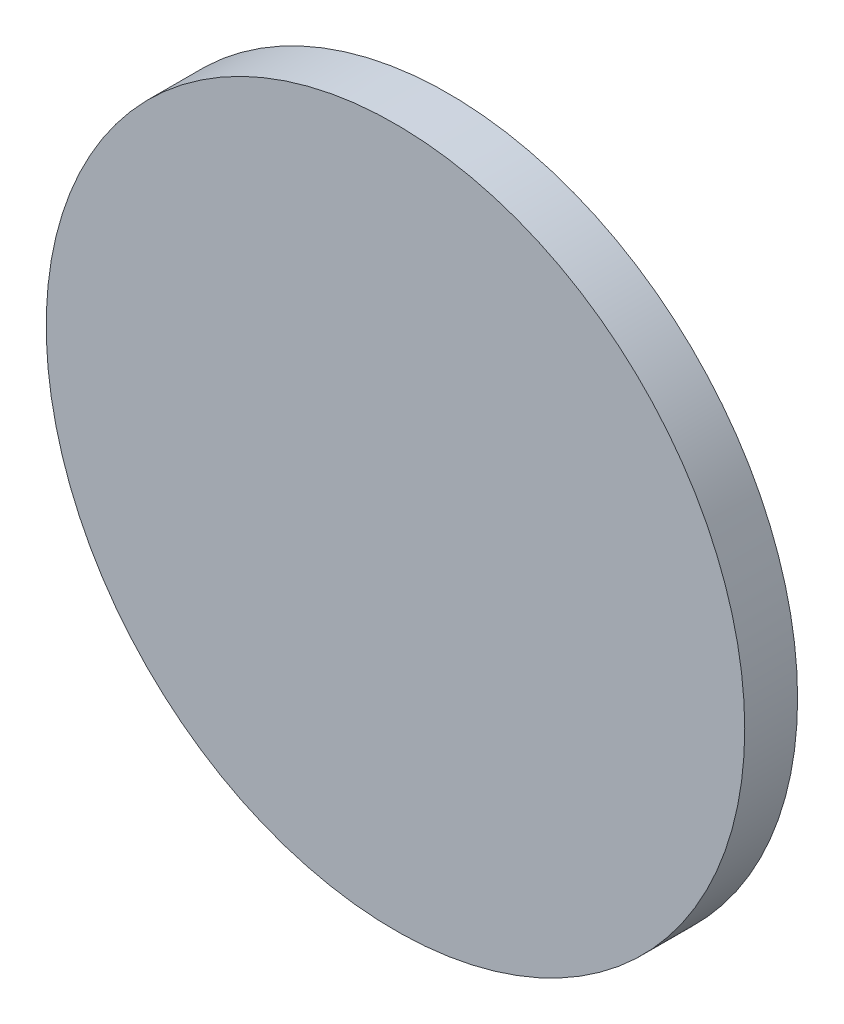
ISO-10303-21;
HEADER;
FILE_DESCRIPTION(('STEP AP214'),'2;1');
FILE_NAME('part.step','',(''),(''),'','','');
FILE_SCHEMA(('AUTOMOTIVE_DESIGN { 1 0 10303 214 1 1 1 1 }'));
ENDSEC;
DATA;
#1=APPLICATION_CONTEXT('core data for automotive mechanical design processes');
#2=APPLICATION_PROTOCOL_DEFINITION('international standard','automotive_design',2000,#1);
#3=PRODUCT_CONTEXT('',#1,'mechanical');
#4=PRODUCT('Part','Part','',(#3));
#5=PRODUCT_RELATED_PRODUCT_CATEGORY('part','',(#4));
#6=PRODUCT_DEFINITION_FORMATION('','',#4);
#7=PRODUCT_DEFINITION_CONTEXT('part definition',#1,'design');
#8=PRODUCT_DEFINITION('design','',#6,#7);
#9=PRODUCT_DEFINITION_SHAPE('','',#8);
#10=(LENGTH_UNIT() NAMED_UNIT(*) SI_UNIT(.MILLI.,.METRE.));
#11=(NAMED_UNIT(*) PLANE_ANGLE_UNIT() SI_UNIT($,.RADIAN.));
#12=(NAMED_UNIT(*) SI_UNIT($,.STERADIAN.) SOLID_ANGLE_UNIT());
#13=UNCERTAINTY_MEASURE_WITH_UNIT(LENGTH_MEASURE(1.E-05),#10,'distance_accuracy_value','');
#14=(GEOMETRIC_REPRESENTATION_CONTEXT(3) GLOBAL_UNCERTAINTY_ASSIGNED_CONTEXT((#13)) GLOBAL_UNIT_ASSIGNED_CONTEXT((#10,
#11,#12)) REPRESENTATION_CONTEXT('',''));
#15=CARTESIAN_POINT('',(0.,0.,0.));
#16=DIRECTION('',(0.,0.,1.));
#17=DIRECTION('',(1.,0.,0.));
#18=AXIS2_PLACEMENT_3D('',#15,#16,#17);
#19=CARTESIAN_POINT('',(0.,0.,0.0540559050909194));
#20=DIRECTION('',(0.,0.,-1.));
#21=DIRECTION('',(-1.,0.,0.));
#22=AXIS2_PLACEMENT_3D('',#19,#20,#21);
#23=CYLINDRICAL_SURFACE('',#22,8.79);
#24=CARTESIAN_POINT('',(0.,0.,0.0540559050909194));
#25=DIRECTION('',(0.,0.,1.));
#26=DIRECTION('',(1.,0.,0.));
#27=AXIS2_PLACEMENT_3D('',#24,#25,#26);
#28=CIRCLE('',#27,8.79);
#29=CARTESIAN_POINT('',(8.79,0.,0.0540559050909194));
#30=VERTEX_POINT('',#29);
#31=EDGE_CURVE('E11',#30,#30,#28,.T.);
#32=ORIENTED_EDGE('',*,*,#31,.F.);
#33=EDGE_LOOP('',(#32));
#34=FACE_BOUND('',#33,.T.);
#35=CARTESIAN_POINT('',(0.,0.,-1.27594409490908));
#36=DIRECTION('',(0.,0.,1.));
#37=DIRECTION('',(1.,0.,0.));
#38=AXIS2_PLACEMENT_3D('',#35,#36,#37);
#39=CIRCLE('',#38,8.79);
#40=CARTESIAN_POINT('',(8.79,0.,-1.27594409490908));
#41=VERTEX_POINT('',#40);
#42=EDGE_CURVE('E49',#41,#41,#39,.T.);
#43=ORIENTED_EDGE('',*,*,#42,.T.);
#44=EDGE_LOOP('',(#43));
#45=FACE_BOUND('',#44,.T.);
#46=ADVANCED_FACE('F39',(#34,#45),#23,.T.);
#47=CARTESIAN_POINT('',(0.,0.,0.0540559050909194));
#48=DIRECTION('',(0.,0.,1.));
#49=DIRECTION('',(1.,0.,0.));
#50=AXIS2_PLACEMENT_3D('',#47,#48,#49);
#51=PLANE('',#50);
#52=ORIENTED_EDGE('',*,*,#31,.T.);
#53=EDGE_LOOP('',(#52));
#54=FACE_BOUND('',#53,.T.);
#55=ADVANCED_FACE('F54',(#54),#51,.T.);
#56=CARTESIAN_POINT('',(0.,0.,-4.15085296108592));
#57=CARTESIAN_POINT('',(-4.89403847642367,0.,-3.96931299583524));
#58=CARTESIAN_POINT('',(-8.79,0.,-1.27594409490908));
#59=B_SPLINE_CURVE_WITH_KNOTS('',2,(#56,#57,#58),.UNSPECIFIED.,.F.,.F.,(3,3),(0.,1.),.UNSPECIFIED.);
#60=CARTESIAN_POINT('',(0.,0.,-4.15085296108592));
#61=DIRECTION('',(0.,0.,-1.));
#62=AXIS1_PLACEMENT('',#60,#61);
#63=SURFACE_OF_REVOLUTION('',#59,#62);
#64=ORIENTED_EDGE('',*,*,#42,.F.);
#65=EDGE_LOOP('',(#64));
#66=FACE_BOUND('',#65,.T.);
#67=CARTESIAN_POINT('',(0.,0.,-4.15085296108592));
#68=VERTEX_POINT('',#67);
#69=VERTEX_LOOP('',#68);
#70=FACE_BOUND('',#69,.T.);
#71=ADVANCED_FACE('F41',(#66,#70),#63,.F.);
#72=CLOSED_SHELL('',(#46,#55,#71));
#73=MANIFOLD_SOLID_BREP('B2',#72);
#74=ADVANCED_BREP_SHAPE_REPRESENTATION('',(#18,#73),#14);
#75=SHAPE_DEFINITION_REPRESENTATION(#9,#74);
ENDSEC;
END-ISO-10303-21;
